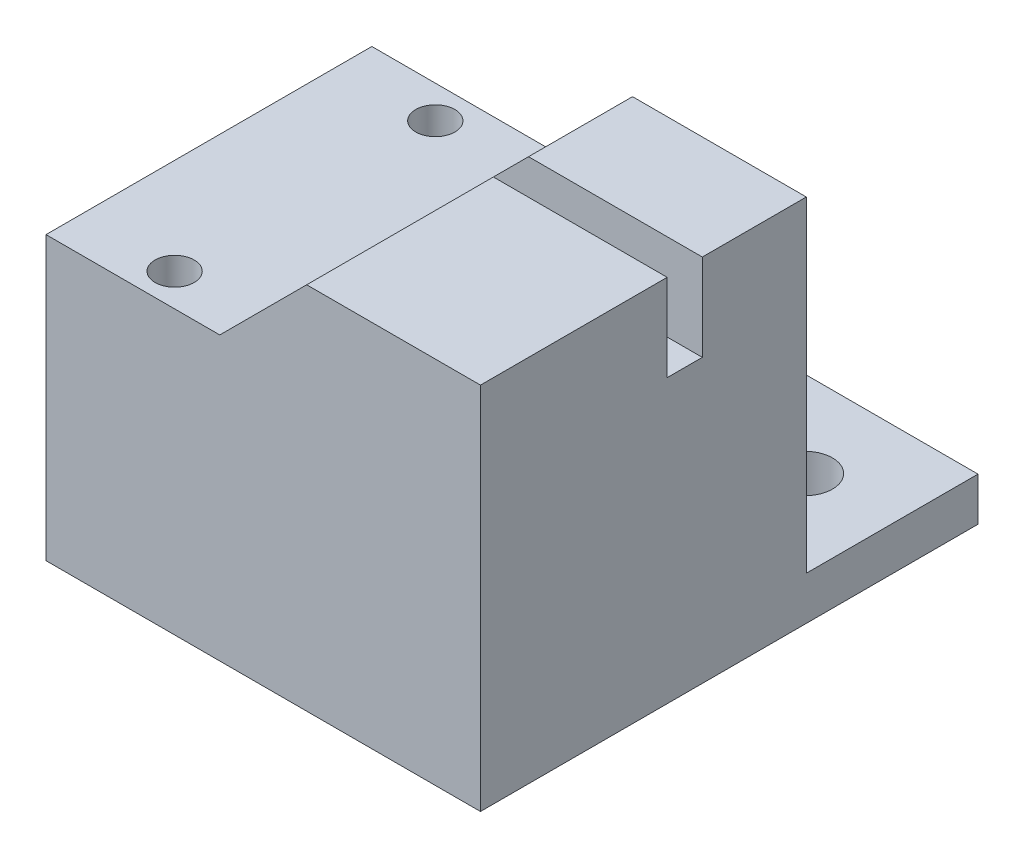
ISO-10303-21;
HEADER;
FILE_DESCRIPTION(('STEP AP214'),'2;1');
FILE_NAME('part.step','',(''),(''),'','','');
FILE_SCHEMA(('AUTOMOTIVE_DESIGN { 1 0 10303 214 1 1 1 1 }'));
ENDSEC;
DATA;
#1=APPLICATION_CONTEXT('core data for automotive mechanical design processes');
#2=APPLICATION_PROTOCOL_DEFINITION('international standard','automotive_design',2000,#1);
#3=PRODUCT_CONTEXT('',#1,'mechanical');
#4=PRODUCT('Part','Part','',(#3));
#5=PRODUCT_RELATED_PRODUCT_CATEGORY('part','',(#4));
#6=PRODUCT_DEFINITION_FORMATION('','',#4);
#7=PRODUCT_DEFINITION_CONTEXT('part definition',#1,'design');
#8=PRODUCT_DEFINITION('design','',#6,#7);
#9=PRODUCT_DEFINITION_SHAPE('','',#8);
#10=(LENGTH_UNIT() NAMED_UNIT(*) SI_UNIT(.MILLI.,.METRE.));
#11=(NAMED_UNIT(*) PLANE_ANGLE_UNIT() SI_UNIT($,.RADIAN.));
#12=(NAMED_UNIT(*) SI_UNIT($,.STERADIAN.) SOLID_ANGLE_UNIT());
#13=UNCERTAINTY_MEASURE_WITH_UNIT(LENGTH_MEASURE(1.E-05),#10,'distance_accuracy_value','');
#14=(GEOMETRIC_REPRESENTATION_CONTEXT(3) GLOBAL_UNCERTAINTY_ASSIGNED_CONTEXT((#13)) GLOBAL_UNIT_ASSIGNED_CONTEXT((#10,
#11,#12)) REPRESENTATION_CONTEXT('',''));
#15=CARTESIAN_POINT('',(0.,0.,0.));
#16=DIRECTION('',(0.,0.,1.));
#17=DIRECTION('',(1.,0.,0.));
#18=AXIS2_PLACEMENT_3D('',#15,#16,#17);
#19=CARTESIAN_POINT('',(-100.,180.,-75.));
#20=DIRECTION('',(0.,0.,1.));
#21=DIRECTION('',(1.,0.,0.));
#22=AXIS2_PLACEMENT_3D('',#19,#20,#21);
#23=PLANE('',#22);
#24=DIRECTION('',(0.707106781186551,0.707106781186544,0.));
#25=VECTOR('',#24,1.);
#26=CARTESIAN_POINT('',(-35.0000000000006,115.,-75.));
#27=LINE('',#26,#25);
#28=CARTESIAN_POINT('',(-20.0000000000005,130.,-75.));
#29=VERTEX_POINT('',#28);
#30=CARTESIAN_POINT('',(19.9999999999998,170.,-75.));
#31=VERTEX_POINT('',#30);
#32=EDGE_CURVE('E139',#29,#31,#27,.T.);
#33=ORIENTED_EDGE('',*,*,#32,.T.);
#34=DIRECTION('',(1.,0.,0.));
#35=VECTOR('',#34,1.);
#36=CARTESIAN_POINT('',(-100.,170.,-75.));
#37=LINE('',#36,#35);
#38=CARTESIAN_POINT('',(100.,170.,-75.));
#39=VERTEX_POINT('',#38);
#40=EDGE_CURVE('E126',#31,#39,#37,.T.);
#41=ORIENTED_EDGE('',*,*,#40,.T.);
#42=DIRECTION('',(0.,-1.,0.));
#43=VECTOR('',#42,1.);
#44=CARTESIAN_POINT('',(100.,180.,-75.));
#45=LINE('',#44,#43);
#46=CARTESIAN_POINT('',(100.,20.,-75.));
#47=VERTEX_POINT('',#46);
#48=EDGE_CURVE('E179',#39,#47,#45,.T.);
#49=ORIENTED_EDGE('',*,*,#48,.T.);
#50=DIRECTION('',(1.,0.,0.));
#51=VECTOR('',#50,1.);
#52=CARTESIAN_POINT('',(-181.527828293936,20.,-74.9999999999999));
#53=LINE('',#52,#51);
#54=CARTESIAN_POINT('',(-100.,20.,-75.));
#55=VERTEX_POINT('',#54);
#56=EDGE_CURVE('E262',#55,#47,#53,.T.);
#57=ORIENTED_EDGE('',*,*,#56,.F.);
#58=DIRECTION('',(0.,-1.,0.));
#59=VECTOR('',#58,1.);
#60=CARTESIAN_POINT('',(-100.,180.,-75.));
#61=LINE('',#60,#59);
#62=CARTESIAN_POINT('',(-100.,130.,-75.));
#63=VERTEX_POINT('',#62);
#64=EDGE_CURVE('E175',#63,#55,#61,.T.);
#65=ORIENTED_EDGE('',*,*,#64,.F.);
#66=DIRECTION('',(1.,0.,0.));
#67=VECTOR('',#66,1.);
#68=CARTESIAN_POINT('',(-100.,130.,-75.));
#69=LINE('',#68,#67);
#70=EDGE_CURVE('E145',#63,#29,#69,.T.);
#71=ORIENTED_EDGE('',*,*,#70,.T.);
#72=EDGE_LOOP('',(#33,#41,#49,#57,#65,#71));
#73=FACE_BOUND('',#72,.T.);
#74=ADVANCED_FACE('F40',(#73),#23,.F.);
#75=CARTESIAN_POINT('',(29.9999999999998,180.,-100.));
#76=DIRECTION('',(0.707106781186544,-0.707106781186551,0.));
#77=DIRECTION('',(0.707106781186551,0.707106781186544,0.));
#78=AXIS2_PLACEMENT_3D('',#75,#76,#77);
#79=PLANE('',#78);
#80=DIRECTION('',(0.707106781186551,0.707106781186544,0.));
#81=VECTOR('',#80,1.);
#82=CARTESIAN_POINT('',(29.9999999999998,180.,-27.1276652491817));
#83=LINE('',#82,#81);
#84=CARTESIAN_POINT('',(-20.0000000000005,130.,-27.1276652491817));
#85=VERTEX_POINT('',#84);
#86=CARTESIAN_POINT('',(19.9999999999996,170.,-27.1276652491817));
#87=VERTEX_POINT('',#86);
#88=EDGE_CURVE('E48',#85,#87,#83,.T.);
#89=ORIENTED_EDGE('',*,*,#88,.T.);
#90=DIRECTION('',(0.,0.,1.));
#91=VECTOR('',#90,1.);
#92=CARTESIAN_POINT('',(19.9999999999998,170.,-154.036616743922));
#93=LINE('',#92,#91);
#94=EDGE_CURVE('E55',#31,#87,#93,.T.);
#95=ORIENTED_EDGE('',*,*,#94,.F.);
#96=ORIENTED_EDGE('',*,*,#32,.F.);
#97=DIRECTION('',(0.,0.,1.));
#98=VECTOR('',#97,1.);
#99=CARTESIAN_POINT('',(-20.0000000000005,130.,-100.));
#100=LINE('',#99,#98);
#101=EDGE_CURVE('E155',#29,#85,#100,.T.);
#102=ORIENTED_EDGE('',*,*,#101,.T.);
#103=EDGE_LOOP('',(#89,#95,#96,#102));
#104=FACE_BOUND('',#103,.T.);
#105=ADVANCED_FACE('F137',(#104),#79,.F.);
#106=CARTESIAN_POINT('',(100.,180.,-75.));
#107=DIRECTION('',(-1.,0.,0.));
#108=DIRECTION('',(0.,0.,1.));
#109=AXIS2_PLACEMENT_3D('',#106,#107,#108);
#110=PLANE('',#109);
#111=ORIENTED_EDGE('',*,*,#48,.F.);
#112=DIRECTION('',(0.,0.,1.));
#113=VECTOR('',#112,1.);
#114=CARTESIAN_POINT('',(100.,170.,-75.));
#115=LINE('',#114,#113);
#116=CARTESIAN_POINT('',(100.,170.,-27.1276652491817));
#117=VERTEX_POINT('',#116);
#118=EDGE_CURVE('E129',#39,#117,#115,.T.);
#119=ORIENTED_EDGE('',*,*,#118,.T.);
#120=DIRECTION('',(0.,1.,0.));
#121=VECTOR('',#120,1.);
#122=CARTESIAN_POINT('',(100.,8.9138312454391,-27.1276652491817));
#123=LINE('',#122,#121);
#124=CARTESIAN_POINT('',(100.,130.,-27.1276652491817));
#125=VERTEX_POINT('',#124);
#126=EDGE_CURVE('E227',#125,#117,#123,.T.);
#127=ORIENTED_EDGE('',*,*,#126,.F.);
#128=DIRECTION('',(0.,0.,-1.));
#129=VECTOR('',#128,1.);
#130=CARTESIAN_POINT('',(100.,130.,-27.1276652491817));
#131=LINE('',#130,#129);
#132=CARTESIAN_POINT('',(100.,130.,-10.9455682386619));
#133=VERTEX_POINT('',#132);
#134=EDGE_CURVE('E232',#133,#125,#131,.T.);
#135=ORIENTED_EDGE('',*,*,#134,.F.);
#136=DIRECTION('',(0.,1.,0.));
#137=VECTOR('',#136,1.);
#138=CARTESIAN_POINT('',(100.,8.9138312454391,-10.9455682386619));
#139=LINE('',#138,#137);
#140=CARTESIAN_POINT('',(100.,170.,-10.9455682386619));
#141=VERTEX_POINT('',#140);
#142=EDGE_CURVE('E214',#133,#141,#139,.T.);
#143=ORIENTED_EDGE('',*,*,#142,.T.);
#144=CARTESIAN_POINT('',(100.,170.,75.));
#145=VERTEX_POINT('',#144);
#146=EDGE_CURVE('E63',#141,#145,#115,.T.);
#147=ORIENTED_EDGE('',*,*,#146,.T.);
#148=DIRECTION('',(0.,-1.,0.));
#149=VECTOR('',#148,1.);
#150=CARTESIAN_POINT('',(100.,180.,75.));
#151=LINE('',#150,#149);
#152=CARTESIAN_POINT('',(100.,0.,75.));
#153=VERTEX_POINT('',#152);
#154=EDGE_CURVE('E169',#145,#153,#151,.T.);
#155=ORIENTED_EDGE('',*,*,#154,.T.);
#156=DIRECTION('',(0.,0.,-1.));
#157=VECTOR('',#156,1.);
#158=CARTESIAN_POINT('',(100.,0.,-75.));
#159=LINE('',#158,#157);
#160=CARTESIAN_POINT('',(100.,0.,-154.036616743922));
#161=VERTEX_POINT('',#160);
#162=EDGE_CURVE('E152',#153,#161,#159,.T.);
#163=ORIENTED_EDGE('',*,*,#162,.T.);
#164=DIRECTION('',(0.,1.,0.));
#165=VECTOR('',#164,1.);
#166=CARTESIAN_POINT('',(100.,0.,-154.036616743922));
#167=LINE('',#166,#165);
#168=CARTESIAN_POINT('',(100.,20.,-154.036616743922));
#169=VERTEX_POINT('',#168);
#170=EDGE_CURVE('E268',#161,#169,#167,.T.);
#171=ORIENTED_EDGE('',*,*,#170,.T.);
#172=DIRECTION('',(0.,0.,1.));
#173=VECTOR('',#172,1.);
#174=CARTESIAN_POINT('',(100.,20.,-75.));
#175=LINE('',#174,#173);
#176=EDGE_CURVE('E260',#169,#47,#175,.T.);
#177=ORIENTED_EDGE('',*,*,#176,.T.);
#178=EDGE_LOOP('',(#111,#119,#127,#135,#143,#147,#155,#163,#171,#177));
#179=FACE_BOUND('',#178,.T.);
#180=ADVANCED_FACE('F42',(#179),#110,.F.);
#181=CARTESIAN_POINT('',(-100.,180.,-75.));
#182=DIRECTION('',(1.,0.,0.));
#183=DIRECTION('',(0.,0.,-1.));
#184=AXIS2_PLACEMENT_3D('',#181,#182,#183);
#185=PLANE('',#184);
#186=DIRECTION('',(0.,-1.,0.));
#187=VECTOR('',#186,1.);
#188=CARTESIAN_POINT('',(-100.,180.,75.));
#189=LINE('',#188,#187);
#190=CARTESIAN_POINT('',(-100.,130.,75.));
#191=VERTEX_POINT('',#190);
#192=CARTESIAN_POINT('',(-100.,0.,75.));
#193=VERTEX_POINT('',#192);
#194=EDGE_CURVE('E172',#191,#193,#189,.T.);
#195=ORIENTED_EDGE('',*,*,#194,.F.);
#196=DIRECTION('',(0.,0.,1.));
#197=VECTOR('',#196,1.);
#198=CARTESIAN_POINT('',(-100.,130.,-100.));
#199=LINE('',#198,#197);
#200=EDGE_CURVE('E223',#63,#191,#199,.T.);
#201=ORIENTED_EDGE('',*,*,#200,.F.);
#202=ORIENTED_EDGE('',*,*,#64,.T.);
#203=DIRECTION('',(0.,0.,-1.));
#204=VECTOR('',#203,1.);
#205=CARTESIAN_POINT('',(-100.,20.,-75.));
#206=LINE('',#205,#204);
#207=CARTESIAN_POINT('',(-100.,20.,-154.036616743922));
#208=VERTEX_POINT('',#207);
#209=EDGE_CURVE('E252',#55,#208,#206,.T.);
#210=ORIENTED_EDGE('',*,*,#209,.T.);
#211=DIRECTION('',(0.,-1.,0.));
#212=VECTOR('',#211,1.);
#213=CARTESIAN_POINT('',(-100.,0.,-154.036616743922));
#214=LINE('',#213,#212);
#215=CARTESIAN_POINT('',(-100.,0.,-154.036616743922));
#216=VERTEX_POINT('',#215);
#217=EDGE_CURVE('E265',#208,#216,#214,.T.);
#218=ORIENTED_EDGE('',*,*,#217,.T.);
#219=DIRECTION('',(0.,0.,1.));
#220=VECTOR('',#219,1.);
#221=CARTESIAN_POINT('',(-100.,0.,-75.));
#222=LINE('',#221,#220);
#223=EDGE_CURVE('E161',#216,#193,#222,.T.);
#224=ORIENTED_EDGE('',*,*,#223,.T.);
#225=EDGE_LOOP('',(#195,#201,#202,#210,#218,#224));
#226=FACE_BOUND('',#225,.T.);
#227=ADVANCED_FACE('F308',(#226),#185,.F.);
#228=CARTESIAN_POINT('',(-100.,180.,75.));
#229=DIRECTION('',(0.,0.,-1.));
#230=DIRECTION('',(-1.,0.,0.));
#231=AXIS2_PLACEMENT_3D('',#228,#229,#230);
#232=PLANE('',#231);
#233=ORIENTED_EDGE('',*,*,#154,.F.);
#234=DIRECTION('',(-1.,0.,0.));
#235=VECTOR('',#234,1.);
#236=CARTESIAN_POINT('',(-100.,170.,75.));
#237=LINE('',#236,#235);
#238=CARTESIAN_POINT('',(19.9999999999998,170.,75.));
#239=VERTEX_POINT('',#238);
#240=EDGE_CURVE('E287',#145,#239,#237,.T.);
#241=ORIENTED_EDGE('',*,*,#240,.T.);
#242=DIRECTION('',(-0.707106781186551,-0.707106781186544,0.));
#243=VECTOR('',#242,1.);
#244=CARTESIAN_POINT('',(-35.0000000000006,115.,75.));
#245=LINE('',#244,#243);
#246=CARTESIAN_POINT('',(-20.0000000000005,130.,75.));
#247=VERTEX_POINT('',#246);
#248=EDGE_CURVE('E147',#239,#247,#245,.T.);
#249=ORIENTED_EDGE('',*,*,#248,.T.);
#250=DIRECTION('',(-1.,0.,0.));
#251=VECTOR('',#250,1.);
#252=CARTESIAN_POINT('',(-100.,130.,75.));
#253=LINE('',#252,#251);
#254=EDGE_CURVE('E182',#247,#191,#253,.T.);
#255=ORIENTED_EDGE('',*,*,#254,.T.);
#256=ORIENTED_EDGE('',*,*,#194,.T.);
#257=DIRECTION('',(1.,0.,0.));
#258=VECTOR('',#257,1.);
#259=CARTESIAN_POINT('',(-100.,0.,75.));
#260=LINE('',#259,#258);
#261=EDGE_CURVE('E165',#193,#153,#260,.T.);
#262=ORIENTED_EDGE('',*,*,#261,.T.);
#263=EDGE_LOOP('',(#233,#241,#249,#255,#256,#262));
#264=FACE_BOUND('',#263,.T.);
#265=ADVANCED_FACE('F293',(#264),#232,.F.);
#266=CARTESIAN_POINT('',(0.,0.,0.));
#267=DIRECTION('',(0.,1.,0.));
#268=DIRECTION('',(0.,0.,1.));
#269=AXIS2_PLACEMENT_3D('',#266,#267,#268);
#270=PLANE('',#269);
#271=CARTESIAN_POINT('',(-60.0000000000001,0.,-114.518308371961));
#272=DIRECTION('',(0.,1.,0.));
#273=DIRECTION('',(0.,0.,1.));
#274=AXIS2_PLACEMENT_3D('',#271,#272,#273);
#275=CIRCLE('',#274,12.5);
#276=CARTESIAN_POINT('',(-60.0000000000001,0.,-102.018308371961));
#277=VERTEX_POINT('',#276);
#278=EDGE_CURVE('E271',#277,#277,#275,.T.);
#279=ORIENTED_EDGE('',*,*,#278,.T.);
#280=EDGE_LOOP('',(#279));
#281=FACE_BOUND('',#280,.T.);
#282=CARTESIAN_POINT('',(60.0000000000001,0.,-114.518308371961));
#283=DIRECTION('',(0.,1.,0.));
#284=DIRECTION('',(0.,0.,1.));
#285=AXIS2_PLACEMENT_3D('',#282,#283,#284);
#286=CIRCLE('',#285,12.5);
#287=CARTESIAN_POINT('',(60.0000000000001,0.,-102.018308371961));
#288=VERTEX_POINT('',#287);
#289=EDGE_CURVE('E277',#288,#288,#286,.T.);
#290=ORIENTED_EDGE('',*,*,#289,.T.);
#291=EDGE_LOOP('',(#290));
#292=FACE_BOUND('',#291,.T.);
#293=ORIENTED_EDGE('',*,*,#162,.F.);
#294=ORIENTED_EDGE('',*,*,#261,.F.);
#295=ORIENTED_EDGE('',*,*,#223,.F.);
#296=DIRECTION('',(1.,0.,0.));
#297=VECTOR('',#296,1.);
#298=CARTESIAN_POINT('',(-181.527828293936,0.,-154.036616743922));
#299=LINE('',#298,#297);
#300=EDGE_CURVE('E256',#216,#161,#299,.T.);
#301=ORIENTED_EDGE('',*,*,#300,.T.);
#302=EDGE_LOOP('',(#293,#294,#295,#301));
#303=FACE_BOUND('',#302,.T.);
#304=ADVANCED_FACE('F315',(#281,#292,#303),#270,.F.);
#305=CARTESIAN_POINT('',(-20.0000000000005,130.,-100.));
#306=DIRECTION('',(0.,-1.,0.));
#307=DIRECTION('',(1.,0.,0.));
#308=AXIS2_PLACEMENT_3D('',#305,#306,#307);
#309=PLANE('',#308);
#310=CARTESIAN_POINT('',(-55.7869105772402,130.,60.));
#311=DIRECTION('',(0.,1.,0.));
#312=DIRECTION('',(-1.,0.,0.));
#313=AXIS2_PLACEMENT_3D('',#310,#311,#312);
#314=CIRCLE('',#313,9.);
#315=CARTESIAN_POINT('',(-64.7869105772402,130.,60.));
#316=VERTEX_POINT('',#315);
#317=EDGE_CURVE('E249',#316,#316,#314,.T.);
#318=ORIENTED_EDGE('',*,*,#317,.F.);
#319=EDGE_LOOP('',(#318));
#320=FACE_BOUND('',#319,.T.);
#321=CARTESIAN_POINT('',(-55.7869105772402,130.,-60.));
#322=DIRECTION('',(0.,1.,0.));
#323=DIRECTION('',(-1.,0.,0.));
#324=AXIS2_PLACEMENT_3D('',#321,#322,#323);
#325=CIRCLE('',#324,9.);
#326=CARTESIAN_POINT('',(-64.7869105772402,130.,-60.));
#327=VERTEX_POINT('',#326);
#328=EDGE_CURVE('E241',#327,#327,#325,.T.);
#329=ORIENTED_EDGE('',*,*,#328,.F.);
#330=EDGE_LOOP('',(#329));
#331=FACE_BOUND('',#330,.T.);
#332=ORIENTED_EDGE('',*,*,#200,.T.);
#333=ORIENTED_EDGE('',*,*,#254,.F.);
#334=CARTESIAN_POINT('',(-20.0000000000005,130.,-10.9455682386619));
#335=VERTEX_POINT('',#334);
#336=EDGE_CURVE('E207',#335,#247,#100,.T.);
#337=ORIENTED_EDGE('',*,*,#336,.F.);
#338=DIRECTION('',(1.,0.,0.));
#339=VECTOR('',#338,1.);
#340=CARTESIAN_POINT('',(100.,130.,-10.9455682386619));
#341=LINE('',#340,#339);
#342=EDGE_CURVE('E211',#335,#133,#341,.T.);
#343=ORIENTED_EDGE('',*,*,#342,.T.);
#344=ORIENTED_EDGE('',*,*,#134,.T.);
#345=DIRECTION('',(-1.,0.,0.));
#346=VECTOR('',#345,1.);
#347=CARTESIAN_POINT('',(100.,130.,-27.1276652491817));
#348=LINE('',#347,#346);
#349=EDGE_CURVE('E219',#125,#85,#348,.T.);
#350=ORIENTED_EDGE('',*,*,#349,.T.);
#351=ORIENTED_EDGE('',*,*,#101,.F.);
#352=ORIENTED_EDGE('',*,*,#70,.F.);
#353=EDGE_LOOP('',(#332,#333,#337,#343,#344,#350,#351,#352));
#354=FACE_BOUND('',#353,.T.);
#355=ADVANCED_FACE('F221',(#320,#331,#354),#309,.F.);
#356=ORIENTED_EDGE('',*,*,#248,.F.);
#357=CARTESIAN_POINT('',(19.9999999999998,170.,-10.9455682386619));
#358=VERTEX_POINT('',#357);
#359=EDGE_CURVE('E141',#358,#239,#93,.T.);
#360=ORIENTED_EDGE('',*,*,#359,.F.);
#361=DIRECTION('',(-0.707106781186551,-0.707106781186544,0.));
#362=VECTOR('',#361,1.);
#363=CARTESIAN_POINT('',(29.9999999999998,180.,-10.9455682386619));
#364=LINE('',#363,#362);
#365=EDGE_CURVE('E186',#358,#335,#364,.T.);
#366=ORIENTED_EDGE('',*,*,#365,.T.);
#367=ORIENTED_EDGE('',*,*,#336,.T.);
#368=EDGE_LOOP('',(#356,#360,#366,#367));
#369=FACE_BOUND('',#368,.T.);
#370=ADVANCED_FACE('F205',(#369),#79,.F.);
#371=CARTESIAN_POINT('',(100.,8.9138312454391,-27.1276652491817));
#372=DIRECTION('',(0.,0.,-1.));
#373=DIRECTION('',(-1.,0.,0.));
#374=AXIS2_PLACEMENT_3D('',#371,#372,#373);
#375=PLANE('',#374);
#376=ORIENTED_EDGE('',*,*,#126,.T.);
#377=DIRECTION('',(-1.,0.,0.));
#378=VECTOR('',#377,1.);
#379=CARTESIAN_POINT('',(100.,170.,-27.1276652491817));
#380=LINE('',#379,#378);
#381=EDGE_CURVE('E285',#117,#87,#380,.T.);
#382=ORIENTED_EDGE('',*,*,#381,.T.);
#383=ORIENTED_EDGE('',*,*,#88,.F.);
#384=ORIENTED_EDGE('',*,*,#349,.F.);
#385=EDGE_LOOP('',(#376,#382,#383,#384));
#386=FACE_BOUND('',#385,.T.);
#387=ADVANCED_FACE('F299',(#386),#375,.F.);
#388=CARTESIAN_POINT('',(100.,8.9138312454391,-10.9455682386619));
#389=DIRECTION('',(0.,0.,1.));
#390=DIRECTION('',(1.,0.,0.));
#391=AXIS2_PLACEMENT_3D('',#388,#389,#390);
#392=PLANE('',#391);
#393=ORIENTED_EDGE('',*,*,#365,.F.);
#394=DIRECTION('',(1.,0.,0.));
#395=VECTOR('',#394,1.);
#396=CARTESIAN_POINT('',(100.,170.,-10.9455682386619));
#397=LINE('',#396,#395);
#398=EDGE_CURVE('E11',#358,#141,#397,.T.);
#399=ORIENTED_EDGE('',*,*,#398,.T.);
#400=ORIENTED_EDGE('',*,*,#142,.F.);
#401=ORIENTED_EDGE('',*,*,#342,.F.);
#402=EDGE_LOOP('',(#393,#399,#400,#401));
#403=FACE_BOUND('',#402,.T.);
#404=ADVANCED_FACE('F212',(#403),#392,.F.);
#405=CARTESIAN_POINT('',(-55.7869105772402,110.,-60.));
#406=DIRECTION('',(0.,1.,0.));
#407=DIRECTION('',(-1.,0.,0.));
#408=AXIS2_PLACEMENT_3D('',#405,#406,#407);
#409=CYLINDRICAL_SURFACE('',#408,9.);
#410=CARTESIAN_POINT('',(-55.7869105772402,110.,-60.));
#411=DIRECTION('',(0.,1.,0.));
#412=DIRECTION('',(-1.,0.,0.));
#413=AXIS2_PLACEMENT_3D('',#410,#411,#412);
#414=CIRCLE('',#413,9.);
#415=CARTESIAN_POINT('',(-64.7869105772402,110.,-60.));
#416=VERTEX_POINT('',#415);
#417=EDGE_CURVE('E240',#416,#416,#414,.T.);
#418=ORIENTED_EDGE('',*,*,#417,.F.);
#419=EDGE_LOOP('',(#418));
#420=FACE_BOUND('',#419,.T.);
#421=ORIENTED_EDGE('',*,*,#328,.T.);
#422=EDGE_LOOP('',(#421));
#423=FACE_BOUND('',#422,.T.);
#424=ADVANCED_FACE('F433',(#420,#423),#409,.F.);
#425=CARTESIAN_POINT('',(-55.7869105772402,110.,-60.));
#426=DIRECTION('',(0.,1.,0.));
#427=DIRECTION('',(-1.,0.,0.));
#428=AXIS2_PLACEMENT_3D('',#425,#426,#427);
#429=PLANE('',#428);
#430=ORIENTED_EDGE('',*,*,#417,.T.);
#431=EDGE_LOOP('',(#430));
#432=FACE_BOUND('',#431,.T.);
#433=ADVANCED_FACE('F423',(#432),#429,.T.);
#434=CARTESIAN_POINT('',(-55.7869105772402,110.,60.));
#435=DIRECTION('',(0.,1.,0.));
#436=DIRECTION('',(-1.,0.,0.));
#437=AXIS2_PLACEMENT_3D('',#434,#435,#436);
#438=CYLINDRICAL_SURFACE('',#437,9.);
#439=CARTESIAN_POINT('',(-55.7869105772402,110.,60.));
#440=DIRECTION('',(0.,1.,0.));
#441=DIRECTION('',(-1.,0.,0.));
#442=AXIS2_PLACEMENT_3D('',#439,#440,#441);
#443=CIRCLE('',#442,9.);
#444=CARTESIAN_POINT('',(-64.7869105772402,110.,60.));
#445=VERTEX_POINT('',#444);
#446=EDGE_CURVE('E245',#445,#445,#443,.T.);
#447=ORIENTED_EDGE('',*,*,#446,.F.);
#448=EDGE_LOOP('',(#447));
#449=FACE_BOUND('',#448,.T.);
#450=ORIENTED_EDGE('',*,*,#317,.T.);
#451=EDGE_LOOP('',(#450));
#452=FACE_BOUND('',#451,.T.);
#453=ADVANCED_FACE('F414',(#449,#452),#438,.F.);
#454=CARTESIAN_POINT('',(-55.7869105772402,110.,60.));
#455=DIRECTION('',(0.,1.,0.));
#456=DIRECTION('',(-1.,0.,0.));
#457=AXIS2_PLACEMENT_3D('',#454,#455,#456);
#458=PLANE('',#457);
#459=ORIENTED_EDGE('',*,*,#446,.T.);
#460=EDGE_LOOP('',(#459));
#461=FACE_BOUND('',#460,.T.);
#462=ADVANCED_FACE('F385',(#461),#458,.T.);
#463=CARTESIAN_POINT('',(-181.527828293936,20.,-74.9999999999999));
#464=DIRECTION('',(0.,1.,0.));
#465=DIRECTION('',(0.,0.,1.));
#466=AXIS2_PLACEMENT_3D('',#463,#464,#465);
#467=PLANE('',#466);
#468=CARTESIAN_POINT('',(-60.0000000000001,20.,-114.518308371961));
#469=DIRECTION('',(0.,1.,0.));
#470=DIRECTION('',(0.,0.,1.));
#471=AXIS2_PLACEMENT_3D('',#468,#469,#470);
#472=CIRCLE('',#471,12.5);
#473=CARTESIAN_POINT('',(-60.0000000000001,20.,-102.018308371961));
#474=VERTEX_POINT('',#473);
#475=EDGE_CURVE('E280',#474,#474,#472,.T.);
#476=ORIENTED_EDGE('',*,*,#475,.F.);
#477=EDGE_LOOP('',(#476));
#478=FACE_BOUND('',#477,.T.);
#479=CARTESIAN_POINT('',(60.0000000000001,20.,-114.518308371961));
#480=DIRECTION('',(0.,1.,0.));
#481=DIRECTION('',(0.,0.,1.));
#482=AXIS2_PLACEMENT_3D('',#479,#480,#481);
#483=CIRCLE('',#482,12.5);
#484=CARTESIAN_POINT('',(60.0000000000001,20.,-102.018308371961));
#485=VERTEX_POINT('',#484);
#486=EDGE_CURVE('E133',#485,#485,#483,.T.);
#487=ORIENTED_EDGE('',*,*,#486,.F.);
#488=EDGE_LOOP('',(#487));
#489=FACE_BOUND('',#488,.T.);
#490=ORIENTED_EDGE('',*,*,#209,.F.);
#491=ORIENTED_EDGE('',*,*,#56,.T.);
#492=ORIENTED_EDGE('',*,*,#176,.F.);
#493=DIRECTION('',(1.,0.,0.));
#494=VECTOR('',#493,1.);
#495=CARTESIAN_POINT('',(-181.527828293936,20.,-154.036616743922));
#496=LINE('',#495,#494);
#497=EDGE_CURVE('E259',#208,#169,#496,.T.);
#498=ORIENTED_EDGE('',*,*,#497,.F.);
#499=EDGE_LOOP('',(#490,#491,#492,#498));
#500=FACE_BOUND('',#499,.T.);
#501=ADVANCED_FACE('F303',(#478,#489,#500),#467,.T.);
#502=CARTESIAN_POINT('',(-181.527828293936,0.,-154.036616743922));
#503=DIRECTION('',(0.,0.,-1.));
#504=DIRECTION('',(-1.,0.,0.));
#505=AXIS2_PLACEMENT_3D('',#502,#503,#504);
#506=PLANE('',#505);
#507=ORIENTED_EDGE('',*,*,#217,.F.);
#508=ORIENTED_EDGE('',*,*,#497,.T.);
#509=ORIENTED_EDGE('',*,*,#170,.F.);
#510=ORIENTED_EDGE('',*,*,#300,.F.);
#511=EDGE_LOOP('',(#507,#508,#509,#510));
#512=FACE_BOUND('',#511,.T.);
#513=ADVANCED_FACE('F312',(#512),#506,.T.);
#514=CARTESIAN_POINT('',(60.0000000000001,-190.,-114.518308371961));
#515=DIRECTION('',(0.,1.,0.));
#516=DIRECTION('',(0.,0.,1.));
#517=AXIS2_PLACEMENT_3D('',#514,#515,#516);
#518=CYLINDRICAL_SURFACE('',#517,12.5);
#519=ORIENTED_EDGE('',*,*,#486,.T.);
#520=EDGE_LOOP('',(#519));
#521=FACE_BOUND('',#520,.T.);
#522=ORIENTED_EDGE('',*,*,#289,.F.);
#523=EDGE_LOOP('',(#522));
#524=FACE_BOUND('',#523,.T.);
#525=ADVANCED_FACE('F361',(#521,#524),#518,.F.);
#526=CARTESIAN_POINT('',(-60.0000000000001,-190.,-114.518308371961));
#527=DIRECTION('',(0.,1.,0.));
#528=DIRECTION('',(0.,0.,1.));
#529=AXIS2_PLACEMENT_3D('',#526,#527,#528);
#530=CYLINDRICAL_SURFACE('',#529,12.5);
#531=ORIENTED_EDGE('',*,*,#475,.T.);
#532=EDGE_LOOP('',(#531));
#533=FACE_BOUND('',#532,.T.);
#534=ORIENTED_EDGE('',*,*,#278,.F.);
#535=EDGE_LOOP('',(#534));
#536=FACE_BOUND('',#535,.T.);
#537=ADVANCED_FACE('F356',(#533,#536),#530,.F.);
#538=CARTESIAN_POINT('',(19.9999999999998,170.,-154.036616743922));
#539=DIRECTION('',(0.,-1.,0.));
#540=DIRECTION('',(0.,0.,-1.));
#541=AXIS2_PLACEMENT_3D('',#538,#539,#540);
#542=PLANE('',#541);
#543=ORIENTED_EDGE('',*,*,#146,.F.);
#544=ORIENTED_EDGE('',*,*,#398,.F.);
#545=ORIENTED_EDGE('',*,*,#359,.T.);
#546=ORIENTED_EDGE('',*,*,#240,.F.);
#547=EDGE_LOOP('',(#543,#544,#545,#546));
#548=FACE_BOUND('',#547,.T.);
#549=ADVANCED_FACE('F290',(#548),#542,.F.);
#550=ORIENTED_EDGE('',*,*,#94,.T.);
#551=ORIENTED_EDGE('',*,*,#381,.F.);
#552=ORIENTED_EDGE('',*,*,#118,.F.);
#553=ORIENTED_EDGE('',*,*,#40,.F.);
#554=EDGE_LOOP('',(#550,#551,#552,#553));
#555=FACE_BOUND('',#554,.T.);
#556=ADVANCED_FACE('F127',(#555),#542,.F.);
#557=CLOSED_SHELL('',(#74,#105,#180,#227,#265,#304,#355,#370,#387,#404,#424,#433,#453,#462,#501,
#513,#525,#537,#549,#556));
#558=MANIFOLD_SOLID_BREP('B2',#557);
#559=ADVANCED_BREP_SHAPE_REPRESENTATION('',(#18,#558),#14);
#560=SHAPE_DEFINITION_REPRESENTATION(#9,#559);
ENDSEC;
END-ISO-10303-21;
